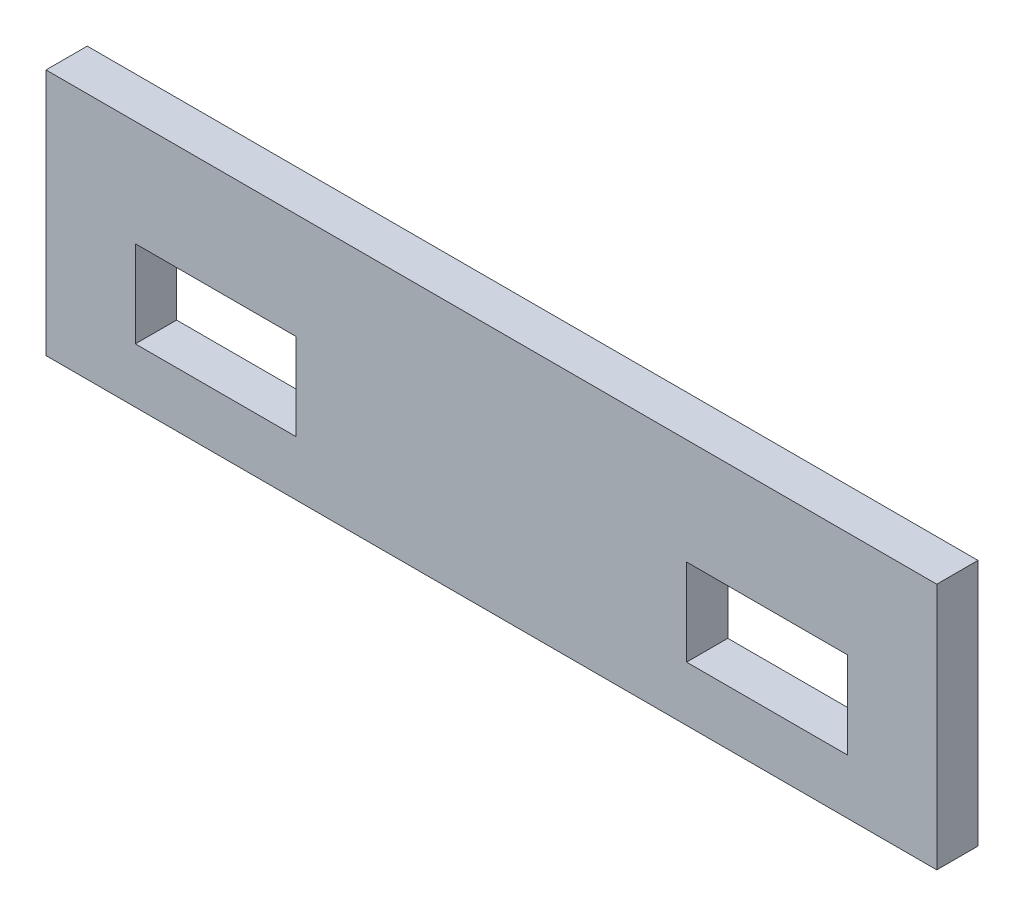
ISO-10303-21;
HEADER;
FILE_DESCRIPTION(('STEP AP214'),'2;1');
FILE_NAME('part.step','',(''),(''),'','','');
FILE_SCHEMA(('AUTOMOTIVE_DESIGN { 1 0 10303 214 1 1 1 1 }'));
ENDSEC;
DATA;
#1=APPLICATION_CONTEXT('core data for automotive mechanical design processes');
#2=APPLICATION_PROTOCOL_DEFINITION('international standard','automotive_design',2000,#1);
#3=PRODUCT_CONTEXT('',#1,'mechanical');
#4=PRODUCT('Part','Part','',(#3));
#5=PRODUCT_RELATED_PRODUCT_CATEGORY('part','',(#4));
#6=PRODUCT_DEFINITION_FORMATION('','',#4);
#7=PRODUCT_DEFINITION_CONTEXT('part definition',#1,'design');
#8=PRODUCT_DEFINITION('design','',#6,#7);
#9=PRODUCT_DEFINITION_SHAPE('','',#8);
#10=(LENGTH_UNIT() NAMED_UNIT(*) SI_UNIT(.MILLI.,.METRE.));
#11=(NAMED_UNIT(*) PLANE_ANGLE_UNIT() SI_UNIT($,.RADIAN.));
#12=(NAMED_UNIT(*) SI_UNIT($,.STERADIAN.) SOLID_ANGLE_UNIT());
#13=UNCERTAINTY_MEASURE_WITH_UNIT(LENGTH_MEASURE(1.E-05),#10,'distance_accuracy_value','');
#14=(GEOMETRIC_REPRESENTATION_CONTEXT(3) GLOBAL_UNCERTAINTY_ASSIGNED_CONTEXT((#13)) GLOBAL_UNIT_ASSIGNED_CONTEXT((#10,
#11,#12)) REPRESENTATION_CONTEXT('',''));
#15=CARTESIAN_POINT('',(0.,0.,0.));
#16=DIRECTION('',(0.,0.,1.));
#17=DIRECTION('',(1.,0.,0.));
#18=AXIS2_PLACEMENT_3D('',#15,#16,#17);
#19=CARTESIAN_POINT('',(0.,0.,0.));
#20=DIRECTION('',(0.,0.,-1.));
#21=DIRECTION('',(-1.,0.,0.));
#22=AXIS2_PLACEMENT_3D('',#19,#20,#21);
#23=PLANE('',#22);
#24=CARTESIAN_POINT('',(150.,20.,0.));
#25=DIRECTION('',(0.,0.,1.));
#26=DIRECTION('',(1.,0.,0.));
#27=AXIS2_PLACEMENT_3D('',#24,#25,#26);
#28=CIRCLE('',#27,2.5);
#29=CARTESIAN_POINT('',(152.5,20.,0.));
#30=VERTEX_POINT('',#29);
#31=EDGE_CURVE('E247',#30,#30,#28,.T.);
#32=ORIENTED_EDGE('',*,*,#31,.T.);
#33=EDGE_LOOP('',(#32));
#34=FACE_BOUND('',#33,.T.);
#35=CARTESIAN_POINT('',(-150.,20.,0.));
#36=DIRECTION('',(0.,0.,1.));
#37=DIRECTION('',(1.,0.,0.));
#38=AXIS2_PLACEMENT_3D('',#35,#36,#37);
#39=CIRCLE('',#38,2.5);
#40=CARTESIAN_POINT('',(-147.5,20.,0.));
#41=VERTEX_POINT('',#40);
#42=EDGE_CURVE('E252',#41,#41,#39,.T.);
#43=ORIENTED_EDGE('',*,*,#42,.T.);
#44=EDGE_LOOP('',(#43));
#45=FACE_BOUND('',#44,.T.);
#46=DIRECTION('',(0.,-1.,0.));
#47=VECTOR('',#46,1.);
#48=CARTESIAN_POINT('',(-162.,0.,0.));
#49=LINE('',#48,#47);
#50=CARTESIAN_POINT('',(-162.,90.,0.));
#51=VERTEX_POINT('',#50);
#52=CARTESIAN_POINT('',(-162.,0.,0.));
#53=VERTEX_POINT('',#52);
#54=EDGE_CURVE('E286',#51,#53,#49,.T.);
#55=ORIENTED_EDGE('',*,*,#54,.F.);
#56=DIRECTION('',(-1.,0.,0.));
#57=VECTOR('',#56,1.);
#58=CARTESIAN_POINT('',(-162.,90.,0.));
#59=LINE('',#58,#57);
#60=CARTESIAN_POINT('',(162.,90.,0.));
#61=VERTEX_POINT('',#60);
#62=EDGE_CURVE('E325',#61,#51,#59,.T.);
#63=ORIENTED_EDGE('',*,*,#62,.F.);
#64=DIRECTION('',(0.,1.,0.));
#65=VECTOR('',#64,1.);
#66=CARTESIAN_POINT('',(162.,0.,0.));
#67=LINE('',#66,#65);
#68=CARTESIAN_POINT('',(162.,0.,0.));
#69=VERTEX_POINT('',#68);
#70=EDGE_CURVE('E331',#69,#61,#67,.T.);
#71=ORIENTED_EDGE('',*,*,#70,.F.);
#72=DIRECTION('',(1.,0.,0.));
#73=VECTOR('',#72,1.);
#74=CARTESIAN_POINT('',(-162.,0.,0.));
#75=LINE('',#74,#73);
#76=EDGE_CURVE('E333',#53,#69,#75,.T.);
#77=ORIENTED_EDGE('',*,*,#76,.F.);
#78=EDGE_LOOP('',(#55,#63,#71,#77));
#79=FACE_BOUND('',#78,.T.);
#80=DIRECTION('',(-1.,0.,0.));
#81=VECTOR('',#80,1.);
#82=CARTESIAN_POINT('',(-65.,51.,0.));
#83=LINE('',#82,#81);
#84=CARTESIAN_POINT('',(-45.,51.,0.));
#85=VERTEX_POINT('',#84);
#86=CARTESIAN_POINT('',(-65.,51.,0.));
#87=VERTEX_POINT('',#86);
#88=EDGE_CURVE('E299',#85,#87,#83,.T.);
#89=ORIENTED_EDGE('',*,*,#88,.T.);
#90=DIRECTION('',(0.,-1.,0.));
#91=VECTOR('',#90,1.);
#92=CARTESIAN_POINT('',(-65.,39.,0.));
#93=LINE('',#92,#91);
#94=CARTESIAN_POINT('',(-65.,39.,0.));
#95=VERTEX_POINT('',#94);
#96=EDGE_CURVE('E272',#87,#95,#93,.T.);
#97=ORIENTED_EDGE('',*,*,#96,.T.);
#98=DIRECTION('',(1.,0.,0.));
#99=VECTOR('',#98,1.);
#100=CARTESIAN_POINT('',(-65.,39.,0.));
#101=LINE('',#100,#99);
#102=CARTESIAN_POINT('',(-45.,39.,0.));
#103=VERTEX_POINT('',#102);
#104=EDGE_CURVE('E306',#95,#103,#101,.T.);
#105=ORIENTED_EDGE('',*,*,#104,.T.);
#106=DIRECTION('',(0.,1.,0.));
#107=VECTOR('',#106,1.);
#108=CARTESIAN_POINT('',(-45.,39.,0.));
#109=LINE('',#108,#107);
#110=EDGE_CURVE('E305',#103,#85,#109,.T.);
#111=ORIENTED_EDGE('',*,*,#110,.T.);
#112=EDGE_LOOP('',(#89,#97,#105,#111));
#113=FACE_BOUND('',#112,.T.);
#114=DIRECTION('',(-1.,0.,0.));
#115=VECTOR('',#114,1.);
#116=CARTESIAN_POINT('',(45.,51.,0.));
#117=LINE('',#116,#115);
#118=CARTESIAN_POINT('',(65.,51.,0.));
#119=VERTEX_POINT('',#118);
#120=CARTESIAN_POINT('',(45.,51.,0.));
#121=VERTEX_POINT('',#120);
#122=EDGE_CURVE('E258',#119,#121,#117,.T.);
#123=ORIENTED_EDGE('',*,*,#122,.T.);
#124=DIRECTION('',(0.,-1.,0.));
#125=VECTOR('',#124,1.);
#126=CARTESIAN_POINT('',(45.,39.,0.));
#127=LINE('',#126,#125);
#128=CARTESIAN_POINT('',(45.,39.,0.));
#129=VERTEX_POINT('',#128);
#130=EDGE_CURVE('E270',#121,#129,#127,.T.);
#131=ORIENTED_EDGE('',*,*,#130,.T.);
#132=DIRECTION('',(1.,0.,0.));
#133=VECTOR('',#132,1.);
#134=CARTESIAN_POINT('',(45.,39.,0.));
#135=LINE('',#134,#133);
#136=CARTESIAN_POINT('',(65.,39.,0.));
#137=VERTEX_POINT('',#136);
#138=EDGE_CURVE('E269',#129,#137,#135,.T.);
#139=ORIENTED_EDGE('',*,*,#138,.T.);
#140=DIRECTION('',(0.,1.,0.));
#141=VECTOR('',#140,1.);
#142=CARTESIAN_POINT('',(65.,39.,0.));
#143=LINE('',#142,#141);
#144=EDGE_CURVE('E274',#137,#119,#143,.T.);
#145=ORIENTED_EDGE('',*,*,#144,.T.);
#146=EDGE_LOOP('',(#123,#131,#139,#145));
#147=FACE_BOUND('',#146,.T.);
#148=DIRECTION('',(-1.,0.,0.));
#149=VECTOR('',#148,1.);
#150=CARTESIAN_POINT('',(-129.5,51.5,0.));
#151=LINE('',#150,#149);
#152=CARTESIAN_POINT('',(-71.,51.5,0.));
#153=VERTEX_POINT('',#152);
#154=CARTESIAN_POINT('',(-129.5,51.5,0.));
#155=VERTEX_POINT('',#154);
#156=EDGE_CURVE('E228',#153,#155,#151,.T.);
#157=ORIENTED_EDGE('',*,*,#156,.T.);
#158=DIRECTION('',(0.,-1.,0.));
#159=VECTOR('',#158,1.);
#160=CARTESIAN_POINT('',(-129.5,19.9474211494529,0.));
#161=LINE('',#160,#159);
#162=CARTESIAN_POINT('',(-129.5,19.9474211494529,0.));
#163=VERTEX_POINT('',#162);
#164=EDGE_CURVE('E65',#155,#163,#161,.T.);
#165=ORIENTED_EDGE('',*,*,#164,.T.);
#166=DIRECTION('',(1.,0.,0.));
#167=VECTOR('',#166,1.);
#168=CARTESIAN_POINT('',(-129.5,19.9474211494529,0.));
#169=LINE('',#168,#167);
#170=CARTESIAN_POINT('',(-71.,19.9474211494529,0.));
#171=VERTEX_POINT('',#170);
#172=EDGE_CURVE('E231',#163,#171,#169,.T.);
#173=ORIENTED_EDGE('',*,*,#172,.T.);
#174=DIRECTION('',(0.,1.,0.));
#175=VECTOR('',#174,1.);
#176=CARTESIAN_POINT('',(-71.,19.9474211494529,0.));
#177=LINE('',#176,#175);
#178=EDGE_CURVE('E230',#171,#153,#177,.T.);
#179=ORIENTED_EDGE('',*,*,#178,.T.);
#180=EDGE_LOOP('',(#157,#165,#173,#179));
#181=FACE_BOUND('',#180,.T.);
#182=DIRECTION('',(-1.,0.,0.));
#183=VECTOR('',#182,1.);
#184=CARTESIAN_POINT('',(71.,51.5,0.));
#185=LINE('',#184,#183);
#186=CARTESIAN_POINT('',(129.5,51.5,0.));
#187=VERTEX_POINT('',#186);
#188=CARTESIAN_POINT('',(71.,51.5,0.));
#189=VERTEX_POINT('',#188);
#190=EDGE_CURVE('E190',#187,#189,#185,.T.);
#191=ORIENTED_EDGE('',*,*,#190,.T.);
#192=DIRECTION('',(0.,-1.,0.));
#193=VECTOR('',#192,1.);
#194=CARTESIAN_POINT('',(71.,19.9474211494529,0.));
#195=LINE('',#194,#193);
#196=CARTESIAN_POINT('',(71.,19.9474211494529,0.));
#197=VERTEX_POINT('',#196);
#198=EDGE_CURVE('E53',#189,#197,#195,.T.);
#199=ORIENTED_EDGE('',*,*,#198,.T.);
#200=DIRECTION('',(1.,0.,0.));
#201=VECTOR('',#200,1.);
#202=CARTESIAN_POINT('',(71.,19.9474211494529,0.));
#203=LINE('',#202,#201);
#204=CARTESIAN_POINT('',(129.5,19.9474211494529,0.));
#205=VERTEX_POINT('',#204);
#206=EDGE_CURVE('E194',#197,#205,#203,.T.);
#207=ORIENTED_EDGE('',*,*,#206,.T.);
#208=DIRECTION('',(0.,1.,0.));
#209=VECTOR('',#208,1.);
#210=CARTESIAN_POINT('',(129.5,19.9474211494529,0.));
#211=LINE('',#210,#209);
#212=EDGE_CURVE('E206',#205,#187,#211,.T.);
#213=ORIENTED_EDGE('',*,*,#212,.T.);
#214=EDGE_LOOP('',(#191,#199,#207,#213));
#215=FACE_BOUND('',#214,.T.);
#216=ADVANCED_FACE('F39',(#34,#45,#79,#113,#147,#181,#215),#23,.T.);
#217=CARTESIAN_POINT('',(0.,0.,15.));
#218=DIRECTION('',(0.,0.,-1.));
#219=DIRECTION('',(-1.,0.,0.));
#220=AXIS2_PLACEMENT_3D('',#217,#218,#219);
#221=PLANE('',#220);
#222=DIRECTION('',(0.,-1.,0.));
#223=VECTOR('',#222,1.);
#224=CARTESIAN_POINT('',(-129.5,19.9474211494529,15.));
#225=LINE('',#224,#223);
#226=CARTESIAN_POINT('',(-129.5,51.5,15.));
#227=VERTEX_POINT('',#226);
#228=CARTESIAN_POINT('',(-129.5,19.9474211494529,15.));
#229=VERTEX_POINT('',#228);
#230=EDGE_CURVE('E229',#227,#229,#225,.T.);
#231=ORIENTED_EDGE('',*,*,#230,.F.);
#232=DIRECTION('',(-1.,0.,0.));
#233=VECTOR('',#232,1.);
#234=CARTESIAN_POINT('',(-129.5,51.5,15.));
#235=LINE('',#234,#233);
#236=CARTESIAN_POINT('',(-71.,51.5,15.));
#237=VERTEX_POINT('',#236);
#238=EDGE_CURVE('E224',#237,#227,#235,.T.);
#239=ORIENTED_EDGE('',*,*,#238,.F.);
#240=DIRECTION('',(0.,1.,0.));
#241=VECTOR('',#240,1.);
#242=CARTESIAN_POINT('',(-71.,19.9474211494529,15.));
#243=LINE('',#242,#241);
#244=CARTESIAN_POINT('',(-71.,19.9474211494529,15.));
#245=VERTEX_POINT('',#244);
#246=EDGE_CURVE('E238',#245,#237,#243,.T.);
#247=ORIENTED_EDGE('',*,*,#246,.F.);
#248=DIRECTION('',(1.,0.,0.));
#249=VECTOR('',#248,1.);
#250=CARTESIAN_POINT('',(-129.5,19.9474211494529,15.));
#251=LINE('',#250,#249);
#252=EDGE_CURVE('E241',#229,#245,#251,.T.);
#253=ORIENTED_EDGE('',*,*,#252,.F.);
#254=EDGE_LOOP('',(#231,#239,#247,#253));
#255=FACE_BOUND('',#254,.T.);
#256=DIRECTION('',(0.,-1.,0.));
#257=VECTOR('',#256,1.);
#258=CARTESIAN_POINT('',(-162.,0.,15.));
#259=LINE('',#258,#257);
#260=CARTESIAN_POINT('',(-162.,90.,15.));
#261=VERTEX_POINT('',#260);
#262=CARTESIAN_POINT('',(-162.,0.,15.));
#263=VERTEX_POINT('',#262);
#264=EDGE_CURVE('E319',#261,#263,#259,.T.);
#265=ORIENTED_EDGE('',*,*,#264,.T.);
#266=DIRECTION('',(1.,0.,0.));
#267=VECTOR('',#266,1.);
#268=CARTESIAN_POINT('',(-162.,0.,15.));
#269=LINE('',#268,#267);
#270=CARTESIAN_POINT('',(162.,0.,15.));
#271=VERTEX_POINT('',#270);
#272=EDGE_CURVE('E322',#263,#271,#269,.T.);
#273=ORIENTED_EDGE('',*,*,#272,.T.);
#274=DIRECTION('',(0.,1.,0.));
#275=VECTOR('',#274,1.);
#276=CARTESIAN_POINT('',(162.,0.,15.));
#277=LINE('',#276,#275);
#278=CARTESIAN_POINT('',(162.,90.,15.));
#279=VERTEX_POINT('',#278);
#280=EDGE_CURVE('E321',#271,#279,#277,.T.);
#281=ORIENTED_EDGE('',*,*,#280,.T.);
#282=DIRECTION('',(-1.,0.,0.));
#283=VECTOR('',#282,1.);
#284=CARTESIAN_POINT('',(-162.,90.,15.));
#285=LINE('',#284,#283);
#286=EDGE_CURVE('E329',#279,#261,#285,.T.);
#287=ORIENTED_EDGE('',*,*,#286,.T.);
#288=EDGE_LOOP('',(#265,#273,#281,#287));
#289=FACE_BOUND('',#288,.T.);
#290=DIRECTION('',(0.,-1.,0.));
#291=VECTOR('',#290,1.);
#292=CARTESIAN_POINT('',(71.,19.9474211494529,15.));
#293=LINE('',#292,#291);
#294=CARTESIAN_POINT('',(71.,51.5,15.));
#295=VERTEX_POINT('',#294);
#296=CARTESIAN_POINT('',(71.,19.9474211494529,15.));
#297=VERTEX_POINT('',#296);
#298=EDGE_CURVE('E178',#295,#297,#293,.T.);
#299=ORIENTED_EDGE('',*,*,#298,.F.);
#300=DIRECTION('',(-1.,0.,0.));
#301=VECTOR('',#300,1.);
#302=CARTESIAN_POINT('',(71.,51.5,15.));
#303=LINE('',#302,#301);
#304=CARTESIAN_POINT('',(129.5,51.5,15.));
#305=VERTEX_POINT('',#304);
#306=EDGE_CURVE('E205',#305,#295,#303,.T.);
#307=ORIENTED_EDGE('',*,*,#306,.F.);
#308=DIRECTION('',(0.,1.,0.));
#309=VECTOR('',#308,1.);
#310=CARTESIAN_POINT('',(129.5,19.9474211494529,15.));
#311=LINE('',#310,#309);
#312=CARTESIAN_POINT('',(129.5,19.9474211494529,15.));
#313=VERTEX_POINT('',#312);
#314=EDGE_CURVE('E197',#313,#305,#311,.T.);
#315=ORIENTED_EDGE('',*,*,#314,.F.);
#316=DIRECTION('',(1.,0.,0.));
#317=VECTOR('',#316,1.);
#318=CARTESIAN_POINT('',(71.,19.9474211494529,15.));
#319=LINE('',#318,#317);
#320=EDGE_CURVE('E187',#297,#313,#319,.T.);
#321=ORIENTED_EDGE('',*,*,#320,.F.);
#322=EDGE_LOOP('',(#299,#307,#315,#321));
#323=FACE_BOUND('',#322,.T.);
#324=ADVANCED_FACE('F200',(#255,#289,#323),#221,.F.);
#325=CARTESIAN_POINT('',(-162.,0.,15.));
#326=DIRECTION('',(1.,0.,0.));
#327=DIRECTION('',(0.,0.,-1.));
#328=AXIS2_PLACEMENT_3D('',#325,#326,#327);
#329=PLANE('',#328);
#330=ORIENTED_EDGE('',*,*,#54,.T.);
#331=DIRECTION('',(0.,0.,-1.));
#332=VECTOR('',#331,1.);
#333=CARTESIAN_POINT('',(-162.,0.,15.));
#334=LINE('',#333,#332);
#335=EDGE_CURVE('E11',#263,#53,#334,.T.);
#336=ORIENTED_EDGE('',*,*,#335,.F.);
#337=ORIENTED_EDGE('',*,*,#264,.F.);
#338=DIRECTION('',(0.,0.,-1.));
#339=VECTOR('',#338,1.);
#340=CARTESIAN_POINT('',(-162.,90.,15.));
#341=LINE('',#340,#339);
#342=EDGE_CURVE('E330',#261,#51,#341,.T.);
#343=ORIENTED_EDGE('',*,*,#342,.T.);
#344=EDGE_LOOP('',(#330,#336,#337,#343));
#345=FACE_BOUND('',#344,.T.);
#346=ADVANCED_FACE('F41',(#345),#329,.F.);
#347=CARTESIAN_POINT('',(-162.,0.,15.));
#348=DIRECTION('',(0.,1.,0.));
#349=DIRECTION('',(0.,0.,1.));
#350=AXIS2_PLACEMENT_3D('',#347,#348,#349);
#351=PLANE('',#350);
#352=ORIENTED_EDGE('',*,*,#76,.T.);
#353=DIRECTION('',(0.,0.,-1.));
#354=VECTOR('',#353,1.);
#355=CARTESIAN_POINT('',(162.,0.,15.));
#356=LINE('',#355,#354);
#357=EDGE_CURVE('E50',#271,#69,#356,.T.);
#358=ORIENTED_EDGE('',*,*,#357,.F.);
#359=ORIENTED_EDGE('',*,*,#272,.F.);
#360=ORIENTED_EDGE('',*,*,#335,.T.);
#361=EDGE_LOOP('',(#352,#358,#359,#360));
#362=FACE_BOUND('',#361,.T.);
#363=ADVANCED_FACE('F359',(#362),#351,.F.);
#364=CARTESIAN_POINT('',(162.,0.,15.));
#365=DIRECTION('',(-1.,0.,0.));
#366=DIRECTION('',(0.,0.,1.));
#367=AXIS2_PLACEMENT_3D('',#364,#365,#366);
#368=PLANE('',#367);
#369=ORIENTED_EDGE('',*,*,#70,.T.);
#370=DIRECTION('',(0.,0.,-1.));
#371=VECTOR('',#370,1.);
#372=CARTESIAN_POINT('',(162.,90.,15.));
#373=LINE('',#372,#371);
#374=EDGE_CURVE('E336',#279,#61,#373,.T.);
#375=ORIENTED_EDGE('',*,*,#374,.F.);
#376=ORIENTED_EDGE('',*,*,#280,.F.);
#377=ORIENTED_EDGE('',*,*,#357,.T.);
#378=EDGE_LOOP('',(#369,#375,#376,#377));
#379=FACE_BOUND('',#378,.T.);
#380=ADVANCED_FACE('F343',(#379),#368,.F.);
#381=CARTESIAN_POINT('',(-162.,90.,15.));
#382=DIRECTION('',(0.,-1.,0.));
#383=DIRECTION('',(0.,0.,-1.));
#384=AXIS2_PLACEMENT_3D('',#381,#382,#383);
#385=PLANE('',#384);
#386=ORIENTED_EDGE('',*,*,#62,.T.);
#387=ORIENTED_EDGE('',*,*,#342,.F.);
#388=ORIENTED_EDGE('',*,*,#286,.F.);
#389=ORIENTED_EDGE('',*,*,#374,.T.);
#390=EDGE_LOOP('',(#386,#387,#388,#389));
#391=FACE_BOUND('',#390,.T.);
#392=ADVANCED_FACE('F352',(#391),#385,.F.);
#393=CARTESIAN_POINT('',(-65.,39.,8.));
#394=DIRECTION('',(1.,0.,0.));
#395=DIRECTION('',(0.,0.,-1.));
#396=AXIS2_PLACEMENT_3D('',#393,#394,#395);
#397=PLANE('',#396);
#398=ORIENTED_EDGE('',*,*,#96,.F.);
#399=DIRECTION('',(0.,0.,-1.));
#400=VECTOR('',#399,1.);
#401=CARTESIAN_POINT('',(-65.,51.,8.));
#402=LINE('',#401,#400);
#403=CARTESIAN_POINT('',(-65.,51.,8.));
#404=VERTEX_POINT('',#403);
#405=EDGE_CURVE('E294',#404,#87,#402,.T.);
#406=ORIENTED_EDGE('',*,*,#405,.F.);
#407=DIRECTION('',(0.,-1.,0.));
#408=VECTOR('',#407,1.);
#409=CARTESIAN_POINT('',(-65.,39.,8.));
#410=LINE('',#409,#408);
#411=CARTESIAN_POINT('',(-65.,39.,8.));
#412=VERTEX_POINT('',#411);
#413=EDGE_CURVE('E303',#404,#412,#410,.T.);
#414=ORIENTED_EDGE('',*,*,#413,.T.);
#415=DIRECTION('',(0.,0.,-1.));
#416=VECTOR('',#415,1.);
#417=CARTESIAN_POINT('',(-65.,39.,8.));
#418=LINE('',#417,#416);
#419=EDGE_CURVE('E250',#412,#95,#418,.T.);
#420=ORIENTED_EDGE('',*,*,#419,.T.);
#421=EDGE_LOOP('',(#398,#406,#414,#420));
#422=FACE_BOUND('',#421,.T.);
#423=ADVANCED_FACE('F379',(#422),#397,.T.);
#424=CARTESIAN_POINT('',(-65.,39.,8.));
#425=DIRECTION('',(0.,1.,0.));
#426=DIRECTION('',(0.,0.,1.));
#427=AXIS2_PLACEMENT_3D('',#424,#425,#426);
#428=PLANE('',#427);
#429=ORIENTED_EDGE('',*,*,#104,.F.);
#430=ORIENTED_EDGE('',*,*,#419,.F.);
#431=DIRECTION('',(1.,0.,0.));
#432=VECTOR('',#431,1.);
#433=CARTESIAN_POINT('',(-65.,39.,8.));
#434=LINE('',#433,#432);
#435=CARTESIAN_POINT('',(-45.,39.,8.));
#436=VERTEX_POINT('',#435);
#437=EDGE_CURVE('E313',#412,#436,#434,.T.);
#438=ORIENTED_EDGE('',*,*,#437,.T.);
#439=DIRECTION('',(0.,0.,-1.));
#440=VECTOR('',#439,1.);
#441=CARTESIAN_POINT('',(-45.,39.,8.));
#442=LINE('',#441,#440);
#443=EDGE_CURVE('E293',#436,#103,#442,.T.);
#444=ORIENTED_EDGE('',*,*,#443,.T.);
#445=EDGE_LOOP('',(#429,#430,#438,#444));
#446=FACE_BOUND('',#445,.T.);
#447=ADVANCED_FACE('F381',(#446),#428,.T.);
#448=CARTESIAN_POINT('',(-45.,39.,8.));
#449=DIRECTION('',(-1.,0.,0.));
#450=DIRECTION('',(0.,0.,1.));
#451=AXIS2_PLACEMENT_3D('',#448,#449,#450);
#452=PLANE('',#451);
#453=ORIENTED_EDGE('',*,*,#110,.F.);
#454=ORIENTED_EDGE('',*,*,#443,.F.);
#455=DIRECTION('',(0.,1.,0.));
#456=VECTOR('',#455,1.);
#457=CARTESIAN_POINT('',(-45.,39.,8.));
#458=LINE('',#457,#456);
#459=CARTESIAN_POINT('',(-45.,51.,8.));
#460=VERTEX_POINT('',#459);
#461=EDGE_CURVE('E315',#436,#460,#458,.T.);
#462=ORIENTED_EDGE('',*,*,#461,.T.);
#463=DIRECTION('',(0.,0.,-1.));
#464=VECTOR('',#463,1.);
#465=CARTESIAN_POINT('',(-45.,51.,8.));
#466=LINE('',#465,#464);
#467=EDGE_CURVE('E291',#460,#85,#466,.T.);
#468=ORIENTED_EDGE('',*,*,#467,.T.);
#469=EDGE_LOOP('',(#453,#454,#462,#468));
#470=FACE_BOUND('',#469,.T.);
#471=ADVANCED_FACE('F388',(#470),#452,.T.);
#472=CARTESIAN_POINT('',(-65.,51.,8.));
#473=DIRECTION('',(0.,-1.,0.));
#474=DIRECTION('',(0.,0.,-1.));
#475=AXIS2_PLACEMENT_3D('',#472,#473,#474);
#476=PLANE('',#475);
#477=ORIENTED_EDGE('',*,*,#88,.F.);
#478=ORIENTED_EDGE('',*,*,#467,.F.);
#479=DIRECTION('',(-1.,0.,0.));
#480=VECTOR('',#479,1.);
#481=CARTESIAN_POINT('',(-65.,51.,8.));
#482=LINE('',#481,#480);
#483=EDGE_CURVE('E296',#460,#404,#482,.T.);
#484=ORIENTED_EDGE('',*,*,#483,.T.);
#485=ORIENTED_EDGE('',*,*,#405,.T.);
#486=EDGE_LOOP('',(#477,#478,#484,#485));
#487=FACE_BOUND('',#486,.T.);
#488=ADVANCED_FACE('F397',(#487),#476,.T.);
#489=CARTESIAN_POINT('',(0.,0.,8.));
#490=DIRECTION('',(0.,0.,-1.));
#491=DIRECTION('',(-1.,0.,0.));
#492=AXIS2_PLACEMENT_3D('',#489,#490,#491);
#493=PLANE('',#492);
#494=ORIENTED_EDGE('',*,*,#413,.F.);
#495=ORIENTED_EDGE('',*,*,#483,.F.);
#496=ORIENTED_EDGE('',*,*,#461,.F.);
#497=ORIENTED_EDGE('',*,*,#437,.F.);
#498=EDGE_LOOP('',(#494,#495,#496,#497));
#499=FACE_BOUND('',#498,.T.);
#500=ADVANCED_FACE('F405',(#499),#493,.T.);
#501=CARTESIAN_POINT('',(45.,39.,8.));
#502=DIRECTION('',(1.,0.,0.));
#503=DIRECTION('',(0.,0.,-1.));
#504=AXIS2_PLACEMENT_3D('',#501,#502,#503);
#505=PLANE('',#504);
#506=ORIENTED_EDGE('',*,*,#130,.F.);
#507=DIRECTION('',(0.,0.,-1.));
#508=VECTOR('',#507,1.);
#509=CARTESIAN_POINT('',(45.,51.,8.));
#510=LINE('',#509,#508);
#511=CARTESIAN_POINT('',(45.,51.,8.));
#512=VERTEX_POINT('',#511);
#513=EDGE_CURVE('E268',#512,#121,#510,.T.);
#514=ORIENTED_EDGE('',*,*,#513,.F.);
#515=DIRECTION('',(0.,-1.,0.));
#516=VECTOR('',#515,1.);
#517=CARTESIAN_POINT('',(45.,39.,8.));
#518=LINE('',#517,#516);
#519=CARTESIAN_POINT('',(45.,39.,8.));
#520=VERTEX_POINT('',#519);
#521=EDGE_CURVE('E257',#512,#520,#518,.T.);
#522=ORIENTED_EDGE('',*,*,#521,.T.);
#523=DIRECTION('',(0.,0.,-1.));
#524=VECTOR('',#523,1.);
#525=CARTESIAN_POINT('',(45.,39.,8.));
#526=LINE('',#525,#524);
#527=EDGE_CURVE('E282',#520,#129,#526,.T.);
#528=ORIENTED_EDGE('',*,*,#527,.T.);
#529=EDGE_LOOP('',(#506,#514,#522,#528));
#530=FACE_BOUND('',#529,.T.);
#531=ADVANCED_FACE('F393',(#530),#505,.T.);
#532=CARTESIAN_POINT('',(45.,39.,8.));
#533=DIRECTION('',(0.,1.,0.));
#534=DIRECTION('',(0.,0.,1.));
#535=AXIS2_PLACEMENT_3D('',#532,#533,#534);
#536=PLANE('',#535);
#537=ORIENTED_EDGE('',*,*,#138,.F.);
#538=ORIENTED_EDGE('',*,*,#527,.F.);
#539=DIRECTION('',(1.,0.,0.));
#540=VECTOR('',#539,1.);
#541=CARTESIAN_POINT('',(45.,39.,8.));
#542=LINE('',#541,#540);
#543=CARTESIAN_POINT('',(65.,39.,8.));
#544=VERTEX_POINT('',#543);
#545=EDGE_CURVE('E256',#520,#544,#542,.T.);
#546=ORIENTED_EDGE('',*,*,#545,.T.);
#547=DIRECTION('',(0.,0.,-1.));
#548=VECTOR('',#547,1.);
#549=CARTESIAN_POINT('',(65.,39.,8.));
#550=LINE('',#549,#548);
#551=EDGE_CURVE('E285',#544,#137,#550,.T.);
#552=ORIENTED_EDGE('',*,*,#551,.T.);
#553=EDGE_LOOP('',(#537,#538,#546,#552));
#554=FACE_BOUND('',#553,.T.);
#555=ADVANCED_FACE('F406',(#554),#536,.T.);
#556=CARTESIAN_POINT('',(65.,39.,8.));
#557=DIRECTION('',(-1.,0.,0.));
#558=DIRECTION('',(0.,0.,1.));
#559=AXIS2_PLACEMENT_3D('',#556,#557,#558);
#560=PLANE('',#559);
#561=ORIENTED_EDGE('',*,*,#144,.F.);
#562=ORIENTED_EDGE('',*,*,#551,.F.);
#563=DIRECTION('',(0.,1.,0.));
#564=VECTOR('',#563,1.);
#565=CARTESIAN_POINT('',(65.,39.,8.));
#566=LINE('',#565,#564);
#567=CARTESIAN_POINT('',(65.,51.,8.));
#568=VERTEX_POINT('',#567);
#569=EDGE_CURVE('E261',#544,#568,#566,.T.);
#570=ORIENTED_EDGE('',*,*,#569,.T.);
#571=DIRECTION('',(0.,0.,-1.));
#572=VECTOR('',#571,1.);
#573=CARTESIAN_POINT('',(65.,51.,8.));
#574=LINE('',#573,#572);
#575=EDGE_CURVE('E284',#568,#119,#574,.T.);
#576=ORIENTED_EDGE('',*,*,#575,.T.);
#577=EDGE_LOOP('',(#561,#562,#570,#576));
#578=FACE_BOUND('',#577,.T.);
#579=ADVANCED_FACE('F478',(#578),#560,.T.);
#580=CARTESIAN_POINT('',(45.,51.,8.));
#581=DIRECTION('',(0.,-1.,0.));
#582=DIRECTION('',(0.,0.,-1.));
#583=AXIS2_PLACEMENT_3D('',#580,#581,#582);
#584=PLANE('',#583);
#585=ORIENTED_EDGE('',*,*,#122,.F.);
#586=ORIENTED_EDGE('',*,*,#575,.F.);
#587=DIRECTION('',(-1.,0.,0.));
#588=VECTOR('',#587,1.);
#589=CARTESIAN_POINT('',(45.,51.,8.));
#590=LINE('',#589,#588);
#591=EDGE_CURVE('E263',#568,#512,#590,.T.);
#592=ORIENTED_EDGE('',*,*,#591,.T.);
#593=ORIENTED_EDGE('',*,*,#513,.T.);
#594=EDGE_LOOP('',(#585,#586,#592,#593));
#595=FACE_BOUND('',#594,.T.);
#596=ADVANCED_FACE('F473',(#595),#584,.T.);
#597=CARTESIAN_POINT('',(0.,0.,8.));
#598=DIRECTION('',(0.,0.,-1.));
#599=DIRECTION('',(-1.,0.,0.));
#600=AXIS2_PLACEMENT_3D('',#597,#598,#599);
#601=PLANE('',#600);
#602=ORIENTED_EDGE('',*,*,#521,.F.);
#603=ORIENTED_EDGE('',*,*,#591,.F.);
#604=ORIENTED_EDGE('',*,*,#569,.F.);
#605=ORIENTED_EDGE('',*,*,#545,.F.);
#606=EDGE_LOOP('',(#602,#603,#604,#605));
#607=FACE_BOUND('',#606,.T.);
#608=ADVANCED_FACE('F466',(#607),#601,.T.);
#609=CARTESIAN_POINT('',(-150.,20.,10.));
#610=DIRECTION('',(0.,0.,-1.));
#611=DIRECTION('',(-1.,0.,0.));
#612=AXIS2_PLACEMENT_3D('',#609,#610,#611);
#613=CYLINDRICAL_SURFACE('',#612,2.5);
#614=CARTESIAN_POINT('',(-150.,20.,10.));
#615=DIRECTION('',(0.,0.,1.));
#616=DIRECTION('',(1.,0.,0.));
#617=AXIS2_PLACEMENT_3D('',#614,#615,#616);
#618=CIRCLE('',#617,2.5);
#619=CARTESIAN_POINT('',(-147.5,20.,10.));
#620=VERTEX_POINT('',#619);
#621=EDGE_CURVE('E191',#620,#620,#618,.T.);
#622=ORIENTED_EDGE('',*,*,#621,.T.);
#623=EDGE_LOOP('',(#622));
#624=FACE_BOUND('',#623,.T.);
#625=ORIENTED_EDGE('',*,*,#42,.F.);
#626=EDGE_LOOP('',(#625));
#627=FACE_BOUND('',#626,.T.);
#628=ADVANCED_FACE('F464',(#624,#627),#613,.F.);
#629=CARTESIAN_POINT('',(-150.,20.,10.));
#630=DIRECTION('',(0.,0.,1.));
#631=DIRECTION('',(1.,0.,0.));
#632=AXIS2_PLACEMENT_3D('',#629,#630,#631);
#633=PLANE('',#632);
#634=ORIENTED_EDGE('',*,*,#621,.F.);
#635=EDGE_LOOP('',(#634));
#636=FACE_BOUND('',#635,.T.);
#637=ADVANCED_FACE('F461',(#636),#633,.F.);
#638=CARTESIAN_POINT('',(150.,20.,10.));
#639=DIRECTION('',(0.,0.,-1.));
#640=DIRECTION('',(-1.,0.,0.));
#641=AXIS2_PLACEMENT_3D('',#638,#639,#640);
#642=CYLINDRICAL_SURFACE('',#641,2.5);
#643=CARTESIAN_POINT('',(150.,20.,10.));
#644=DIRECTION('',(0.,0.,1.));
#645=DIRECTION('',(1.,0.,0.));
#646=AXIS2_PLACEMENT_3D('',#643,#644,#645);
#647=CIRCLE('',#646,2.5);
#648=CARTESIAN_POINT('',(152.5,20.,10.));
#649=VERTEX_POINT('',#648);
#650=EDGE_CURVE('E242',#649,#649,#647,.T.);
#651=ORIENTED_EDGE('',*,*,#650,.T.);
#652=EDGE_LOOP('',(#651));
#653=FACE_BOUND('',#652,.T.);
#654=ORIENTED_EDGE('',*,*,#31,.F.);
#655=EDGE_LOOP('',(#654));
#656=FACE_BOUND('',#655,.T.);
#657=ADVANCED_FACE('F458',(#653,#656),#642,.F.);
#658=CARTESIAN_POINT('',(150.,20.,10.));
#659=DIRECTION('',(0.,0.,1.));
#660=DIRECTION('',(1.,0.,0.));
#661=AXIS2_PLACEMENT_3D('',#658,#659,#660);
#662=PLANE('',#661);
#663=ORIENTED_EDGE('',*,*,#650,.F.);
#664=EDGE_LOOP('',(#663));
#665=FACE_BOUND('',#664,.T.);
#666=ADVANCED_FACE('F450',(#665),#662,.F.);
#667=CARTESIAN_POINT('',(-129.5,19.9474211494529,15.));
#668=DIRECTION('',(1.,0.,0.));
#669=DIRECTION('',(0.,0.,-1.));
#670=AXIS2_PLACEMENT_3D('',#667,#668,#669);
#671=PLANE('',#670);
#672=ORIENTED_EDGE('',*,*,#164,.F.);
#673=DIRECTION('',(0.,0.,-1.));
#674=VECTOR('',#673,1.);
#675=CARTESIAN_POINT('',(-129.5,51.5,15.));
#676=LINE('',#675,#674);
#677=EDGE_CURVE('E221',#227,#155,#676,.T.);
#678=ORIENTED_EDGE('',*,*,#677,.F.);
#679=ORIENTED_EDGE('',*,*,#230,.T.);
#680=DIRECTION('',(0.,0.,-1.));
#681=VECTOR('',#680,1.);
#682=CARTESIAN_POINT('',(-129.5,19.9474211494529,15.));
#683=LINE('',#682,#681);
#684=EDGE_CURVE('E216',#229,#163,#683,.T.);
#685=ORIENTED_EDGE('',*,*,#684,.T.);
#686=EDGE_LOOP('',(#672,#678,#679,#685));
#687=FACE_BOUND('',#686,.T.);
#688=ADVANCED_FACE('F442',(#687),#671,.T.);
#689=CARTESIAN_POINT('',(-129.5,19.9474211494529,15.));
#690=DIRECTION('',(0.,1.,0.));
#691=DIRECTION('',(0.,0.,1.));
#692=AXIS2_PLACEMENT_3D('',#689,#690,#691);
#693=PLANE('',#692);
#694=ORIENTED_EDGE('',*,*,#172,.F.);
#695=ORIENTED_EDGE('',*,*,#684,.F.);
#696=ORIENTED_EDGE('',*,*,#252,.T.);
#697=DIRECTION('',(0.,0.,-1.));
#698=VECTOR('',#697,1.);
#699=CARTESIAN_POINT('',(-71.,19.9474211494529,15.));
#700=LINE('',#699,#698);
#701=EDGE_CURVE('E218',#245,#171,#700,.T.);
#702=ORIENTED_EDGE('',*,*,#701,.T.);
#703=EDGE_LOOP('',(#694,#695,#696,#702));
#704=FACE_BOUND('',#703,.T.);
#705=ADVANCED_FACE('F447',(#704),#693,.T.);
#706=CARTESIAN_POINT('',(-71.,19.9474211494529,15.));
#707=DIRECTION('',(-1.,0.,0.));
#708=DIRECTION('',(0.,0.,1.));
#709=AXIS2_PLACEMENT_3D('',#706,#707,#708);
#710=PLANE('',#709);
#711=ORIENTED_EDGE('',*,*,#178,.F.);
#712=ORIENTED_EDGE('',*,*,#701,.F.);
#713=ORIENTED_EDGE('',*,*,#246,.T.);
#714=DIRECTION('',(0.,0.,-1.));
#715=VECTOR('',#714,1.);
#716=CARTESIAN_POINT('',(-71.,51.5,15.));
#717=LINE('',#716,#715);
#718=EDGE_CURVE('E223',#237,#153,#717,.T.);
#719=ORIENTED_EDGE('',*,*,#718,.T.);
#720=EDGE_LOOP('',(#711,#712,#713,#719));
#721=FACE_BOUND('',#720,.T.);
#722=ADVANCED_FACE('F448',(#721),#710,.T.);
#723=CARTESIAN_POINT('',(-129.5,51.5,15.));
#724=DIRECTION('',(0.,-1.,0.));
#725=DIRECTION('',(0.,0.,-1.));
#726=AXIS2_PLACEMENT_3D('',#723,#724,#725);
#727=PLANE('',#726);
#728=ORIENTED_EDGE('',*,*,#156,.F.);
#729=ORIENTED_EDGE('',*,*,#718,.F.);
#730=ORIENTED_EDGE('',*,*,#238,.T.);
#731=ORIENTED_EDGE('',*,*,#677,.T.);
#732=EDGE_LOOP('',(#728,#729,#730,#731));
#733=FACE_BOUND('',#732,.T.);
#734=ADVANCED_FACE('F445',(#733),#727,.T.);
#735=CARTESIAN_POINT('',(71.,19.9474211494529,15.));
#736=DIRECTION('',(1.,0.,0.));
#737=DIRECTION('',(0.,0.,-1.));
#738=AXIS2_PLACEMENT_3D('',#735,#736,#737);
#739=PLANE('',#738);
#740=ORIENTED_EDGE('',*,*,#198,.F.);
#741=DIRECTION('',(0.,0.,-1.));
#742=VECTOR('',#741,1.);
#743=CARTESIAN_POINT('',(71.,51.5,15.));
#744=LINE('',#743,#742);
#745=EDGE_CURVE('E185',#295,#189,#744,.T.);
#746=ORIENTED_EDGE('',*,*,#745,.F.);
#747=ORIENTED_EDGE('',*,*,#298,.T.);
#748=DIRECTION('',(0.,0.,-1.));
#749=VECTOR('',#748,1.);
#750=CARTESIAN_POINT('',(71.,19.9474211494529,15.));
#751=LINE('',#750,#749);
#752=EDGE_CURVE('E181',#297,#197,#751,.T.);
#753=ORIENTED_EDGE('',*,*,#752,.T.);
#754=EDGE_LOOP('',(#740,#746,#747,#753));
#755=FACE_BOUND('',#754,.T.);
#756=ADVANCED_FACE('F179',(#755),#739,.T.);
#757=CARTESIAN_POINT('',(71.,19.9474211494529,15.));
#758=DIRECTION('',(0.,1.,0.));
#759=DIRECTION('',(0.,0.,1.));
#760=AXIS2_PLACEMENT_3D('',#757,#758,#759);
#761=PLANE('',#760);
#762=ORIENTED_EDGE('',*,*,#206,.F.);
#763=ORIENTED_EDGE('',*,*,#752,.F.);
#764=ORIENTED_EDGE('',*,*,#320,.T.);
#765=DIRECTION('',(0.,0.,-1.));
#766=VECTOR('',#765,1.);
#767=CARTESIAN_POINT('',(129.5,19.9474211494529,15.));
#768=LINE('',#767,#766);
#769=EDGE_CURVE('E193',#313,#205,#768,.T.);
#770=ORIENTED_EDGE('',*,*,#769,.T.);
#771=EDGE_LOOP('',(#762,#763,#764,#770));
#772=FACE_BOUND('',#771,.T.);
#773=ADVANCED_FACE('F188',(#772),#761,.T.);
#774=CARTESIAN_POINT('',(129.5,19.9474211494529,15.));
#775=DIRECTION('',(-1.,0.,0.));
#776=DIRECTION('',(0.,0.,1.));
#777=AXIS2_PLACEMENT_3D('',#774,#775,#776);
#778=PLANE('',#777);
#779=ORIENTED_EDGE('',*,*,#212,.F.);
#780=ORIENTED_EDGE('',*,*,#769,.F.);
#781=ORIENTED_EDGE('',*,*,#314,.T.);
#782=DIRECTION('',(0.,0.,-1.));
#783=VECTOR('',#782,1.);
#784=CARTESIAN_POINT('',(129.5,51.5,15.));
#785=LINE('',#784,#783);
#786=EDGE_CURVE('E211',#305,#187,#785,.T.);
#787=ORIENTED_EDGE('',*,*,#786,.T.);
#788=EDGE_LOOP('',(#779,#780,#781,#787));
#789=FACE_BOUND('',#788,.T.);
#790=ADVANCED_FACE('F427',(#789),#778,.T.);
#791=CARTESIAN_POINT('',(71.,51.5,15.));
#792=DIRECTION('',(0.,-1.,0.));
#793=DIRECTION('',(0.,0.,-1.));
#794=AXIS2_PLACEMENT_3D('',#791,#792,#793);
#795=PLANE('',#794);
#796=ORIENTED_EDGE('',*,*,#190,.F.);
#797=ORIENTED_EDGE('',*,*,#786,.F.);
#798=ORIENTED_EDGE('',*,*,#306,.T.);
#799=ORIENTED_EDGE('',*,*,#745,.T.);
#800=EDGE_LOOP('',(#796,#797,#798,#799));
#801=FACE_BOUND('',#800,.T.);
#802=ADVANCED_FACE('F426',(#801),#795,.T.);
#803=CLOSED_SHELL('',(#216,#324,#346,#363,#380,#392,#423,#447,#471,#488,#500,#531,#555,#579,
#596,#608,#628,#637,#657,#666,#688,#705,#722,#734,#756,#773,#790,#802));
#804=MANIFOLD_SOLID_BREP('B2',#803);
#805=ADVANCED_BREP_SHAPE_REPRESENTATION('',(#18,#804),#14);
#806=SHAPE_DEFINITION_REPRESENTATION(#9,#805);
ENDSEC;
END-ISO-10303-21;
